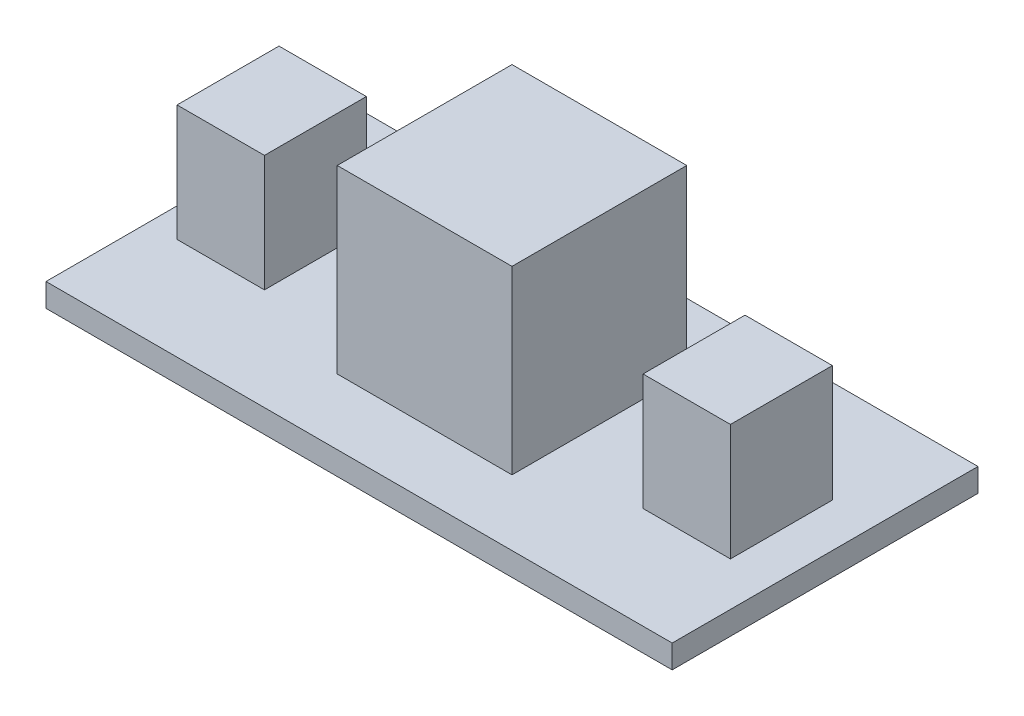
ISO-10303-21;
HEADER;
FILE_DESCRIPTION(('STEP AP214'),'2;1');
FILE_NAME('part.step','',(''),(''),'','','');
FILE_SCHEMA(('AUTOMOTIVE_DESIGN { 1 0 10303 214 1 1 1 1 }'));
ENDSEC;
DATA;
#1=APPLICATION_CONTEXT('core data for automotive mechanical design processes');
#2=APPLICATION_PROTOCOL_DEFINITION('international standard','automotive_design',2000,#1);
#3=PRODUCT_CONTEXT('',#1,'mechanical');
#4=PRODUCT('Part','Part','',(#3));
#5=PRODUCT_RELATED_PRODUCT_CATEGORY('part','',(#4));
#6=PRODUCT_DEFINITION_FORMATION('','',#4);
#7=PRODUCT_DEFINITION_CONTEXT('part definition',#1,'design');
#8=PRODUCT_DEFINITION('design','',#6,#7);
#9=PRODUCT_DEFINITION_SHAPE('','',#8);
#10=(LENGTH_UNIT() NAMED_UNIT(*) SI_UNIT(.MILLI.,.METRE.));
#11=(NAMED_UNIT(*) PLANE_ANGLE_UNIT() SI_UNIT($,.RADIAN.));
#12=(NAMED_UNIT(*) SI_UNIT($,.STERADIAN.) SOLID_ANGLE_UNIT());
#13=UNCERTAINTY_MEASURE_WITH_UNIT(LENGTH_MEASURE(1.E-05),#10,'distance_accuracy_value','');
#14=(GEOMETRIC_REPRESENTATION_CONTEXT(3) GLOBAL_UNCERTAINTY_ASSIGNED_CONTEXT((#13)) GLOBAL_UNIT_ASSIGNED_CONTEXT((#10,
#11,#12)) REPRESENTATION_CONTEXT('',''));
#15=CARTESIAN_POINT('',(0.,0.,0.));
#16=DIRECTION('',(0.,0.,1.));
#17=DIRECTION('',(1.,0.,0.));
#18=AXIS2_PLACEMENT_3D('',#15,#16,#17);
#19=CARTESIAN_POINT('',(0.,1.6,0.));
#20=DIRECTION('',(0.,-1.,0.));
#21=DIRECTION('',(0.,0.,-1.));
#22=AXIS2_PLACEMENT_3D('',#19,#20,#21);
#23=PLANE('',#22);
#24=DIRECTION('',(0.,0.,1.));
#25=VECTOR('',#24,1.);
#26=CARTESIAN_POINT('',(-19.5,1.6,-3.5));
#27=LINE('',#26,#25);
#28=CARTESIAN_POINT('',(-19.5,1.6,-3.5));
#29=VERTEX_POINT('',#28);
#30=CARTESIAN_POINT('',(-19.5,1.6,3.5));
#31=VERTEX_POINT('',#30);
#32=EDGE_CURVE('E189',#29,#31,#27,.T.);
#33=ORIENTED_EDGE('',*,*,#32,.F.);
#34=DIRECTION('',(-1.,0.,0.));
#35=VECTOR('',#34,1.);
#36=CARTESIAN_POINT('',(-13.5,1.6,-3.5));
#37=LINE('',#36,#35);
#38=CARTESIAN_POINT('',(-13.5,1.6,-3.5));
#39=VERTEX_POINT('',#38);
#40=EDGE_CURVE('E201',#39,#29,#37,.T.);
#41=ORIENTED_EDGE('',*,*,#40,.F.);
#42=DIRECTION('',(0.,0.,-1.));
#43=VECTOR('',#42,1.);
#44=CARTESIAN_POINT('',(-13.5,1.6,3.5));
#45=LINE('',#44,#43);
#46=CARTESIAN_POINT('',(-13.5,1.6,3.5));
#47=VERTEX_POINT('',#46);
#48=EDGE_CURVE('E216',#47,#39,#45,.T.);
#49=ORIENTED_EDGE('',*,*,#48,.F.);
#50=DIRECTION('',(1.,0.,0.));
#51=VECTOR('',#50,1.);
#52=CARTESIAN_POINT('',(-19.5,1.6,3.5));
#53=LINE('',#52,#51);
#54=EDGE_CURVE('E195',#31,#47,#53,.T.);
#55=ORIENTED_EDGE('',*,*,#54,.F.);
#56=EDGE_LOOP('',(#33,#41,#49,#55));
#57=FACE_BOUND('',#56,.T.);
#58=DIRECTION('',(0.,0.,-1.));
#59=VECTOR('',#58,1.);
#60=CARTESIAN_POINT('',(21.5,1.6,10.5));
#61=LINE('',#60,#59);
#62=CARTESIAN_POINT('',(21.5,1.6,10.5));
#63=VERTEX_POINT('',#62);
#64=CARTESIAN_POINT('',(21.5,1.6,-10.5));
#65=VERTEX_POINT('',#64);
#66=EDGE_CURVE('E285',#63,#65,#61,.T.);
#67=ORIENTED_EDGE('',*,*,#66,.T.);
#68=DIRECTION('',(-1.,0.,0.));
#69=VECTOR('',#68,1.);
#70=CARTESIAN_POINT('',(-21.5,1.6,-10.5));
#71=LINE('',#70,#69);
#72=CARTESIAN_POINT('',(-21.5,1.6,-10.5));
#73=VERTEX_POINT('',#72);
#74=EDGE_CURVE('E289',#65,#73,#71,.T.);
#75=ORIENTED_EDGE('',*,*,#74,.T.);
#76=DIRECTION('',(0.,0.,1.));
#77=VECTOR('',#76,1.);
#78=CARTESIAN_POINT('',(-21.5,1.6,10.5));
#79=LINE('',#78,#77);
#80=CARTESIAN_POINT('',(-21.5,1.6,10.5));
#81=VERTEX_POINT('',#80);
#82=EDGE_CURVE('E295',#73,#81,#79,.T.);
#83=ORIENTED_EDGE('',*,*,#82,.T.);
#84=DIRECTION('',(1.,0.,0.));
#85=VECTOR('',#84,1.);
#86=CARTESIAN_POINT('',(-21.5,1.6,10.5));
#87=LINE('',#86,#85);
#88=EDGE_CURVE('E293',#81,#63,#87,.T.);
#89=ORIENTED_EDGE('',*,*,#88,.T.);
#90=EDGE_LOOP('',(#67,#75,#83,#89));
#91=FACE_BOUND('',#90,.T.);
#92=DIRECTION('',(0.,0.,1.));
#93=VECTOR('',#92,1.);
#94=CARTESIAN_POINT('',(-6.,1.6,-6.));
#95=LINE('',#94,#93);
#96=CARTESIAN_POINT('',(-6.,1.6,-6.));
#97=VERTEX_POINT('',#96);
#98=CARTESIAN_POINT('',(-6.,1.6,6.));
#99=VERTEX_POINT('',#98);
#100=EDGE_CURVE('E236',#97,#99,#95,.T.);
#101=ORIENTED_EDGE('',*,*,#100,.F.);
#102=DIRECTION('',(-1.,0.,0.));
#103=VECTOR('',#102,1.);
#104=CARTESIAN_POINT('',(6.,1.6,-6.));
#105=LINE('',#104,#103);
#106=CARTESIAN_POINT('',(6.,1.6,-6.));
#107=VERTEX_POINT('',#106);
#108=EDGE_CURVE('E245',#107,#97,#105,.T.);
#109=ORIENTED_EDGE('',*,*,#108,.F.);
#110=DIRECTION('',(0.,0.,-1.));
#111=VECTOR('',#110,1.);
#112=CARTESIAN_POINT('',(6.,1.6,6.));
#113=LINE('',#112,#111);
#114=CARTESIAN_POINT('',(6.,1.6,6.));
#115=VERTEX_POINT('',#114);
#116=EDGE_CURVE('E261',#115,#107,#113,.T.);
#117=ORIENTED_EDGE('',*,*,#116,.F.);
#118=DIRECTION('',(1.,0.,0.));
#119=VECTOR('',#118,1.);
#120=CARTESIAN_POINT('',(-6.,1.6,6.));
#121=LINE('',#120,#119);
#122=EDGE_CURVE('E260',#99,#115,#121,.T.);
#123=ORIENTED_EDGE('',*,*,#122,.F.);
#124=EDGE_LOOP('',(#101,#109,#117,#123));
#125=FACE_BOUND('',#124,.T.);
#126=DIRECTION('',(0.,0.,1.));
#127=VECTOR('',#126,1.);
#128=CARTESIAN_POINT('',(12.5,1.6,-3.5));
#129=LINE('',#128,#127);
#130=CARTESIAN_POINT('',(12.5,1.6,-3.5));
#131=VERTEX_POINT('',#130);
#132=CARTESIAN_POINT('',(12.5,1.6,3.5));
#133=VERTEX_POINT('',#132);
#134=EDGE_CURVE('E183',#131,#133,#129,.T.);
#135=ORIENTED_EDGE('',*,*,#134,.F.);
#136=DIRECTION('',(-1.,0.,0.));
#137=VECTOR('',#136,1.);
#138=CARTESIAN_POINT('',(18.5,1.6,-3.5));
#139=LINE('',#138,#137);
#140=CARTESIAN_POINT('',(18.5,1.6,-3.5));
#141=VERTEX_POINT('',#140);
#142=EDGE_CURVE('E185',#141,#131,#139,.T.);
#143=ORIENTED_EDGE('',*,*,#142,.F.);
#144=DIRECTION('',(0.,0.,-1.));
#145=VECTOR('',#144,1.);
#146=CARTESIAN_POINT('',(18.5,1.6,3.5));
#147=LINE('',#146,#145);
#148=CARTESIAN_POINT('',(18.5,1.6,3.5));
#149=VERTEX_POINT('',#148);
#150=EDGE_CURVE('E68',#149,#141,#147,.T.);
#151=ORIENTED_EDGE('',*,*,#150,.F.);
#152=DIRECTION('',(1.,0.,0.));
#153=VECTOR('',#152,1.);
#154=CARTESIAN_POINT('',(12.5,1.6,3.5));
#155=LINE('',#154,#153);
#156=EDGE_CURVE('E61',#133,#149,#155,.T.);
#157=ORIENTED_EDGE('',*,*,#156,.F.);
#158=EDGE_LOOP('',(#135,#143,#151,#157));
#159=FACE_BOUND('',#158,.T.);
#160=ADVANCED_FACE('F47',(#57,#91,#125,#159),#23,.F.);
#161=CARTESIAN_POINT('',(21.5,1.6,10.5));
#162=DIRECTION('',(-1.,0.,0.));
#163=DIRECTION('',(0.,0.,1.));
#164=AXIS2_PLACEMENT_3D('',#161,#162,#163);
#165=PLANE('',#164);
#166=DIRECTION('',(0.,0.,-1.));
#167=VECTOR('',#166,1.);
#168=CARTESIAN_POINT('',(21.5,0.,10.5));
#169=LINE('',#168,#167);
#170=CARTESIAN_POINT('',(21.5,0.,10.5));
#171=VERTEX_POINT('',#170);
#172=CARTESIAN_POINT('',(21.5,0.,-10.5));
#173=VERTEX_POINT('',#172);
#174=EDGE_CURVE('E282',#171,#173,#169,.T.);
#175=ORIENTED_EDGE('',*,*,#174,.T.);
#176=DIRECTION('',(0.,-1.,0.));
#177=VECTOR('',#176,1.);
#178=CARTESIAN_POINT('',(21.5,1.6,-10.5));
#179=LINE('',#178,#177);
#180=EDGE_CURVE('E11',#65,#173,#179,.T.);
#181=ORIENTED_EDGE('',*,*,#180,.F.);
#182=ORIENTED_EDGE('',*,*,#66,.F.);
#183=DIRECTION('',(0.,-1.,0.));
#184=VECTOR('',#183,1.);
#185=CARTESIAN_POINT('',(21.5,1.6,10.5));
#186=LINE('',#185,#184);
#187=EDGE_CURVE('E297',#63,#171,#186,.T.);
#188=ORIENTED_EDGE('',*,*,#187,.T.);
#189=EDGE_LOOP('',(#175,#181,#182,#188));
#190=FACE_BOUND('',#189,.T.);
#191=ADVANCED_FACE('F51',(#190),#165,.F.);
#192=CARTESIAN_POINT('',(-21.5,1.6,-10.5));
#193=DIRECTION('',(0.,0.,1.));
#194=DIRECTION('',(1.,0.,0.));
#195=AXIS2_PLACEMENT_3D('',#192,#193,#194);
#196=PLANE('',#195);
#197=DIRECTION('',(-1.,0.,0.));
#198=VECTOR('',#197,1.);
#199=CARTESIAN_POINT('',(-21.5,0.,-10.5));
#200=LINE('',#199,#198);
#201=CARTESIAN_POINT('',(-21.5,0.,-10.5));
#202=VERTEX_POINT('',#201);
#203=EDGE_CURVE('E305',#173,#202,#200,.T.);
#204=ORIENTED_EDGE('',*,*,#203,.T.);
#205=DIRECTION('',(0.,-1.,0.));
#206=VECTOR('',#205,1.);
#207=CARTESIAN_POINT('',(-21.5,1.6,-10.5));
#208=LINE('',#207,#206);
#209=EDGE_CURVE('E59',#73,#202,#208,.T.);
#210=ORIENTED_EDGE('',*,*,#209,.F.);
#211=ORIENTED_EDGE('',*,*,#74,.F.);
#212=ORIENTED_EDGE('',*,*,#180,.T.);
#213=EDGE_LOOP('',(#204,#210,#211,#212));
#214=FACE_BOUND('',#213,.T.);
#215=ADVANCED_FACE('F337',(#214),#196,.F.);
#216=CARTESIAN_POINT('',(-21.5,1.6,10.5));
#217=DIRECTION('',(1.,0.,0.));
#218=DIRECTION('',(0.,0.,-1.));
#219=AXIS2_PLACEMENT_3D('',#216,#217,#218);
#220=PLANE('',#219);
#221=DIRECTION('',(0.,0.,1.));
#222=VECTOR('',#221,1.);
#223=CARTESIAN_POINT('',(-21.5,0.,10.5));
#224=LINE('',#223,#222);
#225=CARTESIAN_POINT('',(-21.5,0.,10.5));
#226=VERTEX_POINT('',#225);
#227=EDGE_CURVE('E303',#202,#226,#224,.T.);
#228=ORIENTED_EDGE('',*,*,#227,.T.);
#229=DIRECTION('',(0.,-1.,0.));
#230=VECTOR('',#229,1.);
#231=CARTESIAN_POINT('',(-21.5,1.6,10.5));
#232=LINE('',#231,#230);
#233=EDGE_CURVE('E311',#81,#226,#232,.T.);
#234=ORIENTED_EDGE('',*,*,#233,.F.);
#235=ORIENTED_EDGE('',*,*,#82,.F.);
#236=ORIENTED_EDGE('',*,*,#209,.T.);
#237=EDGE_LOOP('',(#228,#234,#235,#236));
#238=FACE_BOUND('',#237,.T.);
#239=ADVANCED_FACE('F325',(#238),#220,.F.);
#240=CARTESIAN_POINT('',(-21.5,1.6,10.5));
#241=DIRECTION('',(0.,0.,-1.));
#242=DIRECTION('',(-1.,0.,0.));
#243=AXIS2_PLACEMENT_3D('',#240,#241,#242);
#244=PLANE('',#243);
#245=DIRECTION('',(1.,0.,0.));
#246=VECTOR('',#245,1.);
#247=CARTESIAN_POINT('',(-21.5,0.,10.5));
#248=LINE('',#247,#246);
#249=EDGE_CURVE('E286',#226,#171,#248,.T.);
#250=ORIENTED_EDGE('',*,*,#249,.T.);
#251=ORIENTED_EDGE('',*,*,#187,.F.);
#252=ORIENTED_EDGE('',*,*,#88,.F.);
#253=ORIENTED_EDGE('',*,*,#233,.T.);
#254=EDGE_LOOP('',(#250,#251,#252,#253));
#255=FACE_BOUND('',#254,.T.);
#256=ADVANCED_FACE('F332',(#255),#244,.F.);
#257=CARTESIAN_POINT('',(0.,0.,0.));
#258=DIRECTION('',(0.,-1.,0.));
#259=DIRECTION('',(0.,0.,-1.));
#260=AXIS2_PLACEMENT_3D('',#257,#258,#259);
#261=PLANE('',#260);
#262=ORIENTED_EDGE('',*,*,#174,.F.);
#263=ORIENTED_EDGE('',*,*,#249,.F.);
#264=ORIENTED_EDGE('',*,*,#227,.F.);
#265=ORIENTED_EDGE('',*,*,#203,.F.);
#266=EDGE_LOOP('',(#262,#263,#264,#265));
#267=FACE_BOUND('',#266,.T.);
#268=ADVANCED_FACE('F327',(#267),#261,.T.);
#269=CARTESIAN_POINT('',(-6.,14.,-6.));
#270=DIRECTION('',(1.,0.,0.));
#271=DIRECTION('',(0.,0.,-1.));
#272=AXIS2_PLACEMENT_3D('',#269,#270,#271);
#273=PLANE('',#272);
#274=ORIENTED_EDGE('',*,*,#100,.T.);
#275=DIRECTION('',(0.,-1.,0.));
#276=VECTOR('',#275,1.);
#277=CARTESIAN_POINT('',(-6.,14.,6.));
#278=LINE('',#277,#276);
#279=CARTESIAN_POINT('',(-6.,14.,6.));
#280=VERTEX_POINT('',#279);
#281=EDGE_CURVE('E276',#280,#99,#278,.T.);
#282=ORIENTED_EDGE('',*,*,#281,.F.);
#283=DIRECTION('',(0.,0.,1.));
#284=VECTOR('',#283,1.);
#285=CARTESIAN_POINT('',(-6.,14.,-6.));
#286=LINE('',#285,#284);
#287=CARTESIAN_POINT('',(-6.,14.,-6.));
#288=VERTEX_POINT('',#287);
#289=EDGE_CURVE('E239',#288,#280,#286,.T.);
#290=ORIENTED_EDGE('',*,*,#289,.F.);
#291=DIRECTION('',(0.,-1.,0.));
#292=VECTOR('',#291,1.);
#293=CARTESIAN_POINT('',(-6.,14.,-6.));
#294=LINE('',#293,#292);
#295=EDGE_CURVE('E251',#288,#97,#294,.T.);
#296=ORIENTED_EDGE('',*,*,#295,.T.);
#297=EDGE_LOOP('',(#274,#282,#290,#296));
#298=FACE_BOUND('',#297,.T.);
#299=ADVANCED_FACE('F355',(#298),#273,.F.);
#300=CARTESIAN_POINT('',(-6.,14.,6.));
#301=DIRECTION('',(0.,0.,-1.));
#302=DIRECTION('',(-1.,0.,0.));
#303=AXIS2_PLACEMENT_3D('',#300,#301,#302);
#304=PLANE('',#303);
#305=ORIENTED_EDGE('',*,*,#122,.T.);
#306=DIRECTION('',(0.,-1.,0.));
#307=VECTOR('',#306,1.);
#308=CARTESIAN_POINT('',(6.,14.,6.));
#309=LINE('',#308,#307);
#310=CARTESIAN_POINT('',(6.,14.,6.));
#311=VERTEX_POINT('',#310);
#312=EDGE_CURVE('E274',#311,#115,#309,.T.);
#313=ORIENTED_EDGE('',*,*,#312,.F.);
#314=DIRECTION('',(1.,0.,0.));
#315=VECTOR('',#314,1.);
#316=CARTESIAN_POINT('',(-6.,14.,6.));
#317=LINE('',#316,#315);
#318=EDGE_CURVE('E242',#280,#311,#317,.T.);
#319=ORIENTED_EDGE('',*,*,#318,.F.);
#320=ORIENTED_EDGE('',*,*,#281,.T.);
#321=EDGE_LOOP('',(#305,#313,#319,#320));
#322=FACE_BOUND('',#321,.T.);
#323=ADVANCED_FACE('F380',(#322),#304,.F.);
#324=CARTESIAN_POINT('',(6.,14.,6.));
#325=DIRECTION('',(-1.,0.,0.));
#326=DIRECTION('',(0.,0.,1.));
#327=AXIS2_PLACEMENT_3D('',#324,#325,#326);
#328=PLANE('',#327);
#329=ORIENTED_EDGE('',*,*,#116,.T.);
#330=DIRECTION('',(0.,-1.,0.));
#331=VECTOR('',#330,1.);
#332=CARTESIAN_POINT('',(6.,14.,-6.));
#333=LINE('',#332,#331);
#334=CARTESIAN_POINT('',(6.,14.,-6.));
#335=VERTEX_POINT('',#334);
#336=EDGE_CURVE('E271',#335,#107,#333,.T.);
#337=ORIENTED_EDGE('',*,*,#336,.F.);
#338=DIRECTION('',(0.,0.,-1.));
#339=VECTOR('',#338,1.);
#340=CARTESIAN_POINT('',(6.,14.,6.));
#341=LINE('',#340,#339);
#342=EDGE_CURVE('E250',#311,#335,#341,.T.);
#343=ORIENTED_EDGE('',*,*,#342,.F.);
#344=ORIENTED_EDGE('',*,*,#312,.T.);
#345=EDGE_LOOP('',(#329,#337,#343,#344));
#346=FACE_BOUND('',#345,.T.);
#347=ADVANCED_FACE('F389',(#346),#328,.F.);
#348=CARTESIAN_POINT('',(6.,14.,-6.));
#349=DIRECTION('',(0.,0.,1.));
#350=DIRECTION('',(1.,0.,0.));
#351=AXIS2_PLACEMENT_3D('',#348,#349,#350);
#352=PLANE('',#351);
#353=ORIENTED_EDGE('',*,*,#108,.T.);
#354=ORIENTED_EDGE('',*,*,#295,.F.);
#355=DIRECTION('',(-1.,0.,0.));
#356=VECTOR('',#355,1.);
#357=CARTESIAN_POINT('',(6.,14.,-6.));
#358=LINE('',#357,#356);
#359=EDGE_CURVE('E248',#335,#288,#358,.T.);
#360=ORIENTED_EDGE('',*,*,#359,.F.);
#361=ORIENTED_EDGE('',*,*,#336,.T.);
#362=EDGE_LOOP('',(#353,#354,#360,#361));
#363=FACE_BOUND('',#362,.T.);
#364=ADVANCED_FACE('F396',(#363),#352,.F.);
#365=CARTESIAN_POINT('',(0.,14.,0.));
#366=DIRECTION('',(0.,1.,0.));
#367=DIRECTION('',(0.,0.,1.));
#368=AXIS2_PLACEMENT_3D('',#365,#366,#367);
#369=PLANE('',#368);
#370=ORIENTED_EDGE('',*,*,#289,.T.);
#371=ORIENTED_EDGE('',*,*,#318,.T.);
#372=ORIENTED_EDGE('',*,*,#342,.T.);
#373=ORIENTED_EDGE('',*,*,#359,.T.);
#374=EDGE_LOOP('',(#370,#371,#372,#373));
#375=FACE_BOUND('',#374,.T.);
#376=ADVANCED_FACE('F412',(#375),#369,.T.);
#377=CARTESIAN_POINT('',(-19.5,9.6,-3.5));
#378=DIRECTION('',(1.,0.,0.));
#379=DIRECTION('',(0.,0.,-1.));
#380=AXIS2_PLACEMENT_3D('',#377,#378,#379);
#381=PLANE('',#380);
#382=ORIENTED_EDGE('',*,*,#32,.T.);
#383=DIRECTION('',(0.,-1.,0.));
#384=VECTOR('',#383,1.);
#385=CARTESIAN_POINT('',(-19.5,9.6,3.5));
#386=LINE('',#385,#384);
#387=CARTESIAN_POINT('',(-19.5,9.6,3.5));
#388=VERTEX_POINT('',#387);
#389=EDGE_CURVE('E231',#388,#31,#386,.T.);
#390=ORIENTED_EDGE('',*,*,#389,.F.);
#391=DIRECTION('',(0.,0.,1.));
#392=VECTOR('',#391,1.);
#393=CARTESIAN_POINT('',(-19.5,9.6,-3.5));
#394=LINE('',#393,#392);
#395=CARTESIAN_POINT('',(-19.5,9.6,-3.5));
#396=VERTEX_POINT('',#395);
#397=EDGE_CURVE('E196',#396,#388,#394,.T.);
#398=ORIENTED_EDGE('',*,*,#397,.F.);
#399=DIRECTION('',(0.,-1.,0.));
#400=VECTOR('',#399,1.);
#401=CARTESIAN_POINT('',(-19.5,9.6,-3.5));
#402=LINE('',#401,#400);
#403=EDGE_CURVE('E211',#396,#29,#402,.T.);
#404=ORIENTED_EDGE('',*,*,#403,.T.);
#405=EDGE_LOOP('',(#382,#390,#398,#404));
#406=FACE_BOUND('',#405,.T.);
#407=ADVANCED_FACE('F421',(#406),#381,.F.);
#408=CARTESIAN_POINT('',(-19.5,9.6,3.5));
#409=DIRECTION('',(0.,0.,-1.));
#410=DIRECTION('',(-1.,0.,0.));
#411=AXIS2_PLACEMENT_3D('',#408,#409,#410);
#412=PLANE('',#411);
#413=ORIENTED_EDGE('',*,*,#54,.T.);
#414=DIRECTION('',(0.,-1.,0.));
#415=VECTOR('',#414,1.);
#416=CARTESIAN_POINT('',(-13.5,9.6,3.5));
#417=LINE('',#416,#415);
#418=CARTESIAN_POINT('',(-13.5,9.6,3.5));
#419=VERTEX_POINT('',#418);
#420=EDGE_CURVE('E226',#419,#47,#417,.T.);
#421=ORIENTED_EDGE('',*,*,#420,.F.);
#422=DIRECTION('',(1.,0.,0.));
#423=VECTOR('',#422,1.);
#424=CARTESIAN_POINT('',(-19.5,9.6,3.5));
#425=LINE('',#424,#423);
#426=EDGE_CURVE('E205',#388,#419,#425,.T.);
#427=ORIENTED_EDGE('',*,*,#426,.F.);
#428=ORIENTED_EDGE('',*,*,#389,.T.);
#429=EDGE_LOOP('',(#413,#421,#427,#428));
#430=FACE_BOUND('',#429,.T.);
#431=ADVANCED_FACE('F434',(#430),#412,.F.);
#432=CARTESIAN_POINT('',(-13.5,9.6,3.5));
#433=DIRECTION('',(-1.,0.,0.));
#434=DIRECTION('',(0.,0.,1.));
#435=AXIS2_PLACEMENT_3D('',#432,#433,#434);
#436=PLANE('',#435);
#437=ORIENTED_EDGE('',*,*,#48,.T.);
#438=DIRECTION('',(0.,-1.,0.));
#439=VECTOR('',#438,1.);
#440=CARTESIAN_POINT('',(-13.5,9.6,-3.5));
#441=LINE('',#440,#439);
#442=CARTESIAN_POINT('',(-13.5,9.6,-3.5));
#443=VERTEX_POINT('',#442);
#444=EDGE_CURVE('E228',#443,#39,#441,.T.);
#445=ORIENTED_EDGE('',*,*,#444,.F.);
#446=DIRECTION('',(0.,0.,-1.));
#447=VECTOR('',#446,1.);
#448=CARTESIAN_POINT('',(-13.5,9.6,3.5));
#449=LINE('',#448,#447);
#450=EDGE_CURVE('E206',#419,#443,#449,.T.);
#451=ORIENTED_EDGE('',*,*,#450,.F.);
#452=ORIENTED_EDGE('',*,*,#420,.T.);
#453=EDGE_LOOP('',(#437,#445,#451,#452));
#454=FACE_BOUND('',#453,.T.);
#455=ADVANCED_FACE('F449',(#454),#436,.F.);
#456=CARTESIAN_POINT('',(-13.5,9.6,-3.5));
#457=DIRECTION('',(0.,0.,1.));
#458=DIRECTION('',(1.,0.,0.));
#459=AXIS2_PLACEMENT_3D('',#456,#457,#458);
#460=PLANE('',#459);
#461=ORIENTED_EDGE('',*,*,#40,.T.);
#462=ORIENTED_EDGE('',*,*,#403,.F.);
#463=DIRECTION('',(-1.,0.,0.));
#464=VECTOR('',#463,1.);
#465=CARTESIAN_POINT('',(-13.5,9.6,-3.5));
#466=LINE('',#465,#464);
#467=EDGE_CURVE('E207',#443,#396,#466,.T.);
#468=ORIENTED_EDGE('',*,*,#467,.F.);
#469=ORIENTED_EDGE('',*,*,#444,.T.);
#470=EDGE_LOOP('',(#461,#462,#468,#469));
#471=FACE_BOUND('',#470,.T.);
#472=ADVANCED_FACE('F459',(#471),#460,.F.);
#473=CARTESIAN_POINT('',(0.,9.6,0.));
#474=DIRECTION('',(0.,1.,0.));
#475=DIRECTION('',(0.,0.,1.));
#476=AXIS2_PLACEMENT_3D('',#473,#474,#475);
#477=PLANE('',#476);
#478=ORIENTED_EDGE('',*,*,#397,.T.);
#479=ORIENTED_EDGE('',*,*,#426,.T.);
#480=ORIENTED_EDGE('',*,*,#450,.T.);
#481=ORIENTED_EDGE('',*,*,#467,.T.);
#482=EDGE_LOOP('',(#478,#479,#480,#481));
#483=FACE_BOUND('',#482,.T.);
#484=ADVANCED_FACE('F468',(#483),#477,.T.);
#485=CARTESIAN_POINT('',(12.5,9.6,-3.5));
#486=DIRECTION('',(1.,0.,0.));
#487=DIRECTION('',(0.,0.,-1.));
#488=AXIS2_PLACEMENT_3D('',#485,#486,#487);
#489=PLANE('',#488);
#490=ORIENTED_EDGE('',*,*,#134,.T.);
#491=DIRECTION('',(0.,-1.,0.));
#492=VECTOR('',#491,1.);
#493=CARTESIAN_POINT('',(12.5,9.6,3.5));
#494=LINE('',#493,#492);
#495=CARTESIAN_POINT('',(12.5,9.6,3.5));
#496=VERTEX_POINT('',#495);
#497=EDGE_CURVE('E163',#496,#133,#494,.T.);
#498=ORIENTED_EDGE('',*,*,#497,.F.);
#499=DIRECTION('',(0.,0.,1.));
#500=VECTOR('',#499,1.);
#501=CARTESIAN_POINT('',(12.5,9.6,-3.5));
#502=LINE('',#501,#500);
#503=CARTESIAN_POINT('',(12.5,9.6,-3.5));
#504=VERTEX_POINT('',#503);
#505=EDGE_CURVE('E174',#504,#496,#502,.T.);
#506=ORIENTED_EDGE('',*,*,#505,.F.);
#507=DIRECTION('',(0.,-1.,0.));
#508=VECTOR('',#507,1.);
#509=CARTESIAN_POINT('',(12.5,9.6,-3.5));
#510=LINE('',#509,#508);
#511=EDGE_CURVE('E581',#504,#131,#510,.T.);
#512=ORIENTED_EDGE('',*,*,#511,.T.);
#513=EDGE_LOOP('',(#490,#498,#506,#512));
#514=FACE_BOUND('',#513,.T.);
#515=ADVANCED_FACE('F184',(#514),#489,.F.);
#516=CARTESIAN_POINT('',(12.5,9.6,3.5));
#517=DIRECTION('',(0.,0.,-1.));
#518=DIRECTION('',(-1.,0.,0.));
#519=AXIS2_PLACEMENT_3D('',#516,#517,#518);
#520=PLANE('',#519);
#521=ORIENTED_EDGE('',*,*,#156,.T.);
#522=DIRECTION('',(0.,-1.,0.));
#523=VECTOR('',#522,1.);
#524=CARTESIAN_POINT('',(18.5,9.6,3.5));
#525=LINE('',#524,#523);
#526=CARTESIAN_POINT('',(18.5,9.6,3.5));
#527=VERTEX_POINT('',#526);
#528=EDGE_CURVE('E170',#527,#149,#525,.T.);
#529=ORIENTED_EDGE('',*,*,#528,.F.);
#530=DIRECTION('',(1.,0.,0.));
#531=VECTOR('',#530,1.);
#532=CARTESIAN_POINT('',(12.5,9.6,3.5));
#533=LINE('',#532,#531);
#534=EDGE_CURVE('E159',#496,#527,#533,.T.);
#535=ORIENTED_EDGE('',*,*,#534,.F.);
#536=ORIENTED_EDGE('',*,*,#497,.T.);
#537=EDGE_LOOP('',(#521,#529,#535,#536));
#538=FACE_BOUND('',#537,.T.);
#539=ADVANCED_FACE('F165',(#538),#520,.F.);
#540=CARTESIAN_POINT('',(18.5,9.6,3.5));
#541=DIRECTION('',(-1.,0.,0.));
#542=DIRECTION('',(0.,0.,1.));
#543=AXIS2_PLACEMENT_3D('',#540,#541,#542);
#544=PLANE('',#543);
#545=ORIENTED_EDGE('',*,*,#150,.T.);
#546=DIRECTION('',(0.,-1.,0.));
#547=VECTOR('',#546,1.);
#548=CARTESIAN_POINT('',(18.5,9.6,-3.5));
#549=LINE('',#548,#547);
#550=CARTESIAN_POINT('',(18.5,9.6,-3.5));
#551=VERTEX_POINT('',#550);
#552=EDGE_CURVE('E191',#551,#141,#549,.T.);
#553=ORIENTED_EDGE('',*,*,#552,.F.);
#554=DIRECTION('',(0.,0.,-1.));
#555=VECTOR('',#554,1.);
#556=CARTESIAN_POINT('',(18.5,9.6,3.5));
#557=LINE('',#556,#555);
#558=EDGE_CURVE('E173',#527,#551,#557,.T.);
#559=ORIENTED_EDGE('',*,*,#558,.F.);
#560=ORIENTED_EDGE('',*,*,#528,.T.);
#561=EDGE_LOOP('',(#545,#553,#559,#560));
#562=FACE_BOUND('',#561,.T.);
#563=ADVANCED_FACE('F503',(#562),#544,.F.);
#564=CARTESIAN_POINT('',(18.5,9.6,-3.5));
#565=DIRECTION('',(0.,0.,1.));
#566=DIRECTION('',(1.,0.,0.));
#567=AXIS2_PLACEMENT_3D('',#564,#565,#566);
#568=PLANE('',#567);
#569=ORIENTED_EDGE('',*,*,#142,.T.);
#570=ORIENTED_EDGE('',*,*,#511,.F.);
#571=DIRECTION('',(-1.,0.,0.));
#572=VECTOR('',#571,1.);
#573=CARTESIAN_POINT('',(18.5,9.6,-3.5));
#574=LINE('',#573,#572);
#575=EDGE_CURVE('E180',#551,#504,#574,.T.);
#576=ORIENTED_EDGE('',*,*,#575,.F.);
#577=ORIENTED_EDGE('',*,*,#552,.T.);
#578=EDGE_LOOP('',(#569,#570,#576,#577));
#579=FACE_BOUND('',#578,.T.);
#580=ADVANCED_FACE('F508',(#579),#568,.F.);
#581=CARTESIAN_POINT('',(0.,9.6,0.));
#582=DIRECTION('',(0.,1.,0.));
#583=DIRECTION('',(0.,0.,1.));
#584=AXIS2_PLACEMENT_3D('',#581,#582,#583);
#585=PLANE('',#584);
#586=ORIENTED_EDGE('',*,*,#505,.T.);
#587=ORIENTED_EDGE('',*,*,#534,.T.);
#588=ORIENTED_EDGE('',*,*,#558,.T.);
#589=ORIENTED_EDGE('',*,*,#575,.T.);
#590=EDGE_LOOP('',(#586,#587,#588,#589));
#591=FACE_BOUND('',#590,.T.);
#592=ADVANCED_FACE('F171',(#591),#585,.T.);
#593=CLOSED_SHELL('',(#160,#191,#215,#239,#256,#268,#299,#323,#347,#364,#376,#407,#431,#455,
#472,#484,#515,#539,#563,#580,#592));
#594=MANIFOLD_SOLID_BREP('B2',#593);
#595=ADVANCED_BREP_SHAPE_REPRESENTATION('',(#18,#594),#14);
#596=SHAPE_DEFINITION_REPRESENTATION(#9,#595);
ENDSEC;
END-ISO-10303-21;
